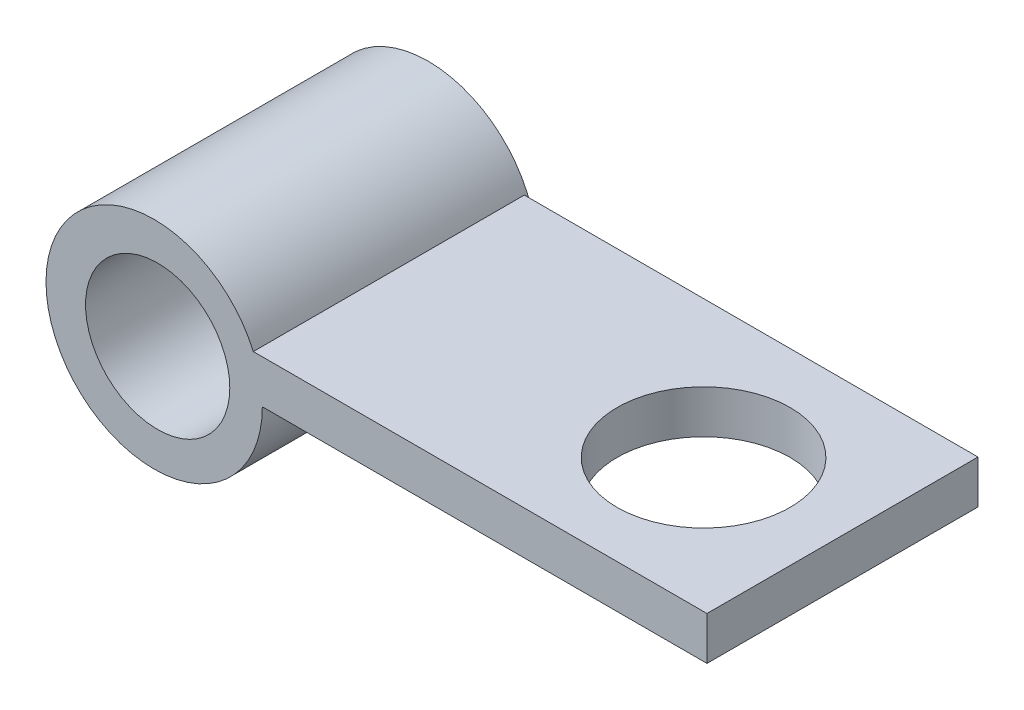
ISO-10303-21;
HEADER;
FILE_DESCRIPTION(('STEP AP214'),'2;1');
FILE_NAME('part.step','',(''),(''),'','','');
FILE_SCHEMA(('AUTOMOTIVE_DESIGN { 1 0 10303 214 1 1 1 1 }'));
ENDSEC;
DATA;
#1=APPLICATION_CONTEXT('core data for automotive mechanical design processes');
#2=APPLICATION_PROTOCOL_DEFINITION('international standard','automotive_design',2000,#1);
#3=PRODUCT_CONTEXT('',#1,'mechanical');
#4=PRODUCT('Part','Part','',(#3));
#5=PRODUCT_RELATED_PRODUCT_CATEGORY('part','',(#4));
#6=PRODUCT_DEFINITION_FORMATION('','',#4);
#7=PRODUCT_DEFINITION_CONTEXT('part definition',#1,'design');
#8=PRODUCT_DEFINITION('design','',#6,#7);
#9=PRODUCT_DEFINITION_SHAPE('','',#8);
#10=(LENGTH_UNIT() NAMED_UNIT(*) SI_UNIT(.MILLI.,.METRE.));
#11=(NAMED_UNIT(*) PLANE_ANGLE_UNIT() SI_UNIT($,.RADIAN.));
#12=(NAMED_UNIT(*) SI_UNIT($,.STERADIAN.) SOLID_ANGLE_UNIT());
#13=UNCERTAINTY_MEASURE_WITH_UNIT(LENGTH_MEASURE(1.E-05),#10,'distance_accuracy_value','');
#14=(GEOMETRIC_REPRESENTATION_CONTEXT(3) GLOBAL_UNCERTAINTY_ASSIGNED_CONTEXT((#13)) GLOBAL_UNIT_ASSIGNED_CONTEXT((#10,
#11,#12)) REPRESENTATION_CONTEXT('',''));
#15=CARTESIAN_POINT('',(0.,0.,0.));
#16=DIRECTION('',(0.,0.,1.));
#17=DIRECTION('',(1.,0.,0.));
#18=AXIS2_PLACEMENT_3D('',#15,#16,#17);
#19=CARTESIAN_POINT('',(0.,3.,0.));
#20=DIRECTION('',(0.,-1.,0.));
#21=DIRECTION('',(0.,0.,-1.));
#22=AXIS2_PLACEMENT_3D('',#19,#20,#21);
#23=PLANE('',#22);
#24=CARTESIAN_POINT('',(20.0737887991713,3.,14.2930884850902));
#25=DIRECTION('',(0.,1.,0.));
#26=DIRECTION('',(0.,0.,1.));
#27=AXIS2_PLACEMENT_3D('',#24,#25,#26);
#28=CIRCLE('',#27,6.);
#29=CARTESIAN_POINT('',(20.0737887991713,3.,20.2930884850902));
#30=VERTEX_POINT('',#29);
#31=EDGE_CURVE('E154',#30,#30,#28,.T.);
#32=ORIENTED_EDGE('',*,*,#31,.F.);
#33=EDGE_LOOP('',(#32));
#34=FACE_BOUND('',#33,.T.);
#35=DIRECTION('',(1.,0.,0.));
#36=VECTOR('',#35,1.);
#37=CARTESIAN_POINT('',(-1.90697269601411,3.,4.75386778375164));
#38=LINE('',#37,#36);
#39=CARTESIAN_POINT('',(-1.89465491964843,3.,4.75386778375164));
#40=VERTEX_POINT('',#39);
#41=CARTESIAN_POINT('',(29.5603977862983,3.,4.75386778375164));
#42=VERTEX_POINT('',#41);
#43=EDGE_CURVE('E157',#40,#42,#38,.T.);
#44=ORIENTED_EDGE('',*,*,#43,.F.);
#45=DIRECTION('',(0.,0.,1.));
#46=VECTOR('',#45,1.);
#47=CARTESIAN_POINT('',(-1.89465491964843,3.,4.54519327125866));
#48=LINE('',#47,#46);
#49=CARTESIAN_POINT('',(-1.89465491964843,3.,23.5451932712587));
#50=VERTEX_POINT('',#49);
#51=EDGE_CURVE('E95',#40,#50,#48,.T.);
#52=ORIENTED_EDGE('',*,*,#51,.T.);
#53=DIRECTION('',(-1.,0.,0.));
#54=VECTOR('',#53,1.);
#55=CARTESIAN_POINT('',(-1.90697269601411,3.,23.5451932712587));
#56=LINE('',#55,#54);
#57=CARTESIAN_POINT('',(29.5603977862983,3.,23.5451932712587));
#58=VERTEX_POINT('',#57);
#59=EDGE_CURVE('E137',#58,#50,#56,.T.);
#60=ORIENTED_EDGE('',*,*,#59,.F.);
#61=DIRECTION('',(0.,0.,1.));
#62=VECTOR('',#61,1.);
#63=CARTESIAN_POINT('',(29.5603977862983,3.,4.75386778375164));
#64=LINE('',#63,#62);
#65=EDGE_CURVE('E118',#42,#58,#64,.T.);
#66=ORIENTED_EDGE('',*,*,#65,.F.);
#67=EDGE_LOOP('',(#44,#52,#60,#66));
#68=FACE_BOUND('',#67,.T.);
#69=ADVANCED_FACE('F81',(#34,#68),#23,.F.);
#70=CARTESIAN_POINT('',(0.,0.,0.));
#71=DIRECTION('',(0.,-1.,0.));
#72=DIRECTION('',(0.,0.,-1.));
#73=AXIS2_PLACEMENT_3D('',#70,#71,#72);
#74=PLANE('',#73);
#75=DIRECTION('',(0.,0.,1.));
#76=VECTOR('',#75,1.);
#77=CARTESIAN_POINT('',(-1.26851846208219,0.,4.54519327125866));
#78=LINE('',#77,#76);
#79=CARTESIAN_POINT('',(-1.26851846208219,0.,4.75386778375164));
#80=VERTEX_POINT('',#79);
#81=CARTESIAN_POINT('',(-1.26851846208219,0.,23.5451932712587));
#82=VERTEX_POINT('',#81);
#83=EDGE_CURVE('E126',#80,#82,#78,.T.);
#84=ORIENTED_EDGE('',*,*,#83,.F.);
#85=DIRECTION('',(1.,0.,0.));
#86=VECTOR('',#85,1.);
#87=CARTESIAN_POINT('',(-1.90697269601411,0.,4.75386778375164));
#88=LINE('',#87,#86);
#89=CARTESIAN_POINT('',(29.5603977862983,0.,4.75386778375164));
#90=VERTEX_POINT('',#89);
#91=EDGE_CURVE('E88',#80,#90,#88,.T.);
#92=ORIENTED_EDGE('',*,*,#91,.T.);
#93=DIRECTION('',(0.,0.,1.));
#94=VECTOR('',#93,1.);
#95=CARTESIAN_POINT('',(29.5603977862983,0.,4.75386778375164));
#96=LINE('',#95,#94);
#97=CARTESIAN_POINT('',(29.5603977862983,0.,23.5451932712587));
#98=VERTEX_POINT('',#97);
#99=EDGE_CURVE('E142',#90,#98,#96,.T.);
#100=ORIENTED_EDGE('',*,*,#99,.T.);
#101=DIRECTION('',(-1.,0.,0.));
#102=VECTOR('',#101,1.);
#103=CARTESIAN_POINT('',(-1.90697269601411,0.,23.5451932712587));
#104=LINE('',#103,#102);
#105=EDGE_CURVE('E135',#98,#82,#104,.T.);
#106=ORIENTED_EDGE('',*,*,#105,.T.);
#107=EDGE_LOOP('',(#84,#92,#100,#106));
#108=FACE_BOUND('',#107,.T.);
#109=CARTESIAN_POINT('',(20.0737887991713,0.,14.2930884850902));
#110=DIRECTION('',(0.,1.,0.));
#111=DIRECTION('',(0.,0.,1.));
#112=AXIS2_PLACEMENT_3D('',#109,#110,#111);
#113=CIRCLE('',#112,6.);
#114=CARTESIAN_POINT('',(20.0737887991713,0.,20.2930884850902));
#115=VERTEX_POINT('',#114);
#116=EDGE_CURVE('E173',#115,#115,#113,.T.);
#117=ORIENTED_EDGE('',*,*,#116,.T.);
#118=EDGE_LOOP('',(#117));
#119=FACE_BOUND('',#118,.T.);
#120=ADVANCED_FACE('F140',(#108,#119),#74,.T.);
#121=CARTESIAN_POINT('',(-1.90697269601411,0.,23.5451932712587));
#122=DIRECTION('',(0.,0.,-1.));
#123=DIRECTION('',(-1.,0.,0.));
#124=AXIS2_PLACEMENT_3D('',#121,#122,#123);
#125=PLANE('',#124);
#126=ORIENTED_EDGE('',*,*,#59,.T.);
#127=CARTESIAN_POINT('',(-8.76851846208219,0.,23.5451932712587));
#128=DIRECTION('',(0.,0.,1.));
#129=DIRECTION('',(1.,0.,0.));
#130=AXIS2_PLACEMENT_3D('',#127,#128,#129);
#131=CIRCLE('',#130,7.5);
#132=EDGE_CURVE('E124',#50,#82,#131,.T.);
#133=ORIENTED_EDGE('',*,*,#132,.T.);
#134=ORIENTED_EDGE('',*,*,#105,.F.);
#135=DIRECTION('',(0.,1.,0.));
#136=VECTOR('',#135,1.);
#137=CARTESIAN_POINT('',(29.5603977862983,0.,23.5451932712587));
#138=LINE('',#137,#136);
#139=EDGE_CURVE('E143',#98,#58,#138,.T.);
#140=ORIENTED_EDGE('',*,*,#139,.T.);
#141=EDGE_LOOP('',(#126,#133,#134,#140));
#142=FACE_BOUND('',#141,.T.);
#143=CARTESIAN_POINT('',(-8.52565226935948,0.,23.5451932712587));
#144=DIRECTION('',(0.,0.,1.));
#145=DIRECTION('',(1.,0.,0.));
#146=AXIS2_PLACEMENT_3D('',#143,#144,#145);
#147=CIRCLE('',#146,5.);
#148=CARTESIAN_POINT('',(-3.52565226935948,0.,23.5451932712587));
#149=VERTEX_POINT('',#148);
#150=EDGE_CURVE('E179',#149,#149,#147,.T.);
#151=ORIENTED_EDGE('',*,*,#150,.F.);
#152=EDGE_LOOP('',(#151));
#153=FACE_BOUND('',#152,.T.);
#154=ADVANCED_FACE('F133',(#142,#153),#125,.F.);
#155=CARTESIAN_POINT('',(29.5603977862983,0.,4.75386778375164));
#156=DIRECTION('',(-1.,0.,0.));
#157=DIRECTION('',(0.,0.,1.));
#158=AXIS2_PLACEMENT_3D('',#155,#156,#157);
#159=PLANE('',#158);
#160=ORIENTED_EDGE('',*,*,#65,.T.);
#161=ORIENTED_EDGE('',*,*,#139,.F.);
#162=ORIENTED_EDGE('',*,*,#99,.F.);
#163=DIRECTION('',(0.,1.,0.));
#164=VECTOR('',#163,1.);
#165=CARTESIAN_POINT('',(29.5603977862983,0.,4.75386778375164));
#166=LINE('',#165,#164);
#167=EDGE_CURVE('E145',#90,#42,#166,.T.);
#168=ORIENTED_EDGE('',*,*,#167,.T.);
#169=EDGE_LOOP('',(#160,#161,#162,#168));
#170=FACE_BOUND('',#169,.T.);
#171=ADVANCED_FACE('F194',(#170),#159,.F.);
#172=CARTESIAN_POINT('',(-1.90697269601411,0.,4.75386778375164));
#173=DIRECTION('',(0.,0.,1.));
#174=DIRECTION('',(1.,0.,0.));
#175=AXIS2_PLACEMENT_3D('',#172,#173,#174);
#176=PLANE('',#175);
#177=ORIENTED_EDGE('',*,*,#91,.F.);
#178=CARTESIAN_POINT('',(-8.76851846208219,0.,4.75386778375164));
#179=DIRECTION('',(0.,0.,1.));
#180=DIRECTION('',(1.,0.,0.));
#181=AXIS2_PLACEMENT_3D('',#178,#179,#180);
#182=CIRCLE('',#181,7.5);
#183=EDGE_CURVE('E12',#80,#40,#182,.T.);
#184=ORIENTED_EDGE('',*,*,#183,.T.);
#185=ORIENTED_EDGE('',*,*,#43,.T.);
#186=ORIENTED_EDGE('',*,*,#167,.F.);
#187=EDGE_LOOP('',(#177,#184,#185,#186));
#188=FACE_BOUND('',#187,.T.);
#189=ADVANCED_FACE('F201',(#188),#176,.F.);
#190=CARTESIAN_POINT('',(20.0737887991713,0.,14.2930884850902));
#191=DIRECTION('',(0.,1.,0.));
#192=DIRECTION('',(0.,0.,1.));
#193=AXIS2_PLACEMENT_3D('',#190,#191,#192);
#194=CYLINDRICAL_SURFACE('',#193,6.);
#195=ORIENTED_EDGE('',*,*,#116,.F.);
#196=EDGE_LOOP('',(#195));
#197=FACE_BOUND('',#196,.T.);
#198=ORIENTED_EDGE('',*,*,#31,.T.);
#199=EDGE_LOOP('',(#198));
#200=FACE_BOUND('',#199,.T.);
#201=ADVANCED_FACE('F204',(#197,#200),#194,.F.);
#202=CARTESIAN_POINT('',(-8.76851846208219,0.,4.54519327125866));
#203=DIRECTION('',(0.,0.,1.));
#204=DIRECTION('',(1.,0.,0.));
#205=AXIS2_PLACEMENT_3D('',#202,#203,#204);
#206=CYLINDRICAL_SURFACE('',#205,7.5);
#207=CARTESIAN_POINT('',(-8.76851846208219,0.,4.54519327125866));
#208=DIRECTION('',(0.,0.,1.));
#209=DIRECTION('',(1.,0.,0.));
#210=AXIS2_PLACEMENT_3D('',#207,#208,#209);
#211=CIRCLE('',#210,7.5);
#212=CARTESIAN_POINT('',(-1.26851846208219,0.,4.54519327125866));
#213=VERTEX_POINT('',#212);
#214=EDGE_CURVE('E129',#213,#213,#211,.T.);
#215=ORIENTED_EDGE('',*,*,#214,.T.);
#216=EDGE_LOOP('',(#215));
#217=FACE_BOUND('',#216,.T.);
#218=ORIENTED_EDGE('',*,*,#51,.F.);
#219=ORIENTED_EDGE('',*,*,#183,.F.);
#220=ORIENTED_EDGE('',*,*,#83,.T.);
#221=ORIENTED_EDGE('',*,*,#132,.F.);
#222=EDGE_LOOP('',(#218,#219,#220,#221));
#223=FACE_BOUND('',#222,.T.);
#224=ADVANCED_FACE('F127',(#217,#223),#206,.T.);
#225=CARTESIAN_POINT('',(-8.76851846208219,0.,4.54519327125866));
#226=DIRECTION('',(0.,0.,1.));
#227=DIRECTION('',(1.,0.,0.));
#228=AXIS2_PLACEMENT_3D('',#225,#226,#227);
#229=PLANE('',#228);
#230=CARTESIAN_POINT('',(-8.52565226935948,0.,4.54519327125866));
#231=DIRECTION('',(0.,0.,1.));
#232=DIRECTION('',(1.,0.,0.));
#233=AXIS2_PLACEMENT_3D('',#230,#231,#232);
#234=CIRCLE('',#233,5.);
#235=CARTESIAN_POINT('',(-3.52565226935948,0.,4.54519327125866));
#236=VERTEX_POINT('',#235);
#237=EDGE_CURVE('E138',#236,#236,#234,.T.);
#238=ORIENTED_EDGE('',*,*,#237,.T.);
#239=EDGE_LOOP('',(#238));
#240=FACE_BOUND('',#239,.T.);
#241=ORIENTED_EDGE('',*,*,#214,.F.);
#242=EDGE_LOOP('',(#241));
#243=FACE_BOUND('',#242,.T.);
#244=ADVANCED_FACE('F185',(#240,#243),#229,.F.);
#245=CARTESIAN_POINT('',(-8.52565226935948,0.,4.54519327125866));
#246=DIRECTION('',(0.,0.,1.));
#247=DIRECTION('',(1.,0.,0.));
#248=AXIS2_PLACEMENT_3D('',#245,#246,#247);
#249=CYLINDRICAL_SURFACE('',#248,5.);
#250=ORIENTED_EDGE('',*,*,#237,.F.);
#251=EDGE_LOOP('',(#250));
#252=FACE_BOUND('',#251,.T.);
#253=ORIENTED_EDGE('',*,*,#150,.T.);
#254=EDGE_LOOP('',(#253));
#255=FACE_BOUND('',#254,.T.);
#256=ADVANCED_FACE('F188',(#252,#255),#249,.F.);
#257=CLOSED_SHELL('',(#69,#120,#154,#171,#189,#201,#224,#244,#256));
#258=MANIFOLD_SOLID_BREP('B2',#257);
#259=ADVANCED_BREP_SHAPE_REPRESENTATION('',(#18,#258),#14);
#260=SHAPE_DEFINITION_REPRESENTATION(#9,#259);
ENDSEC;
END-ISO-10303-21;
